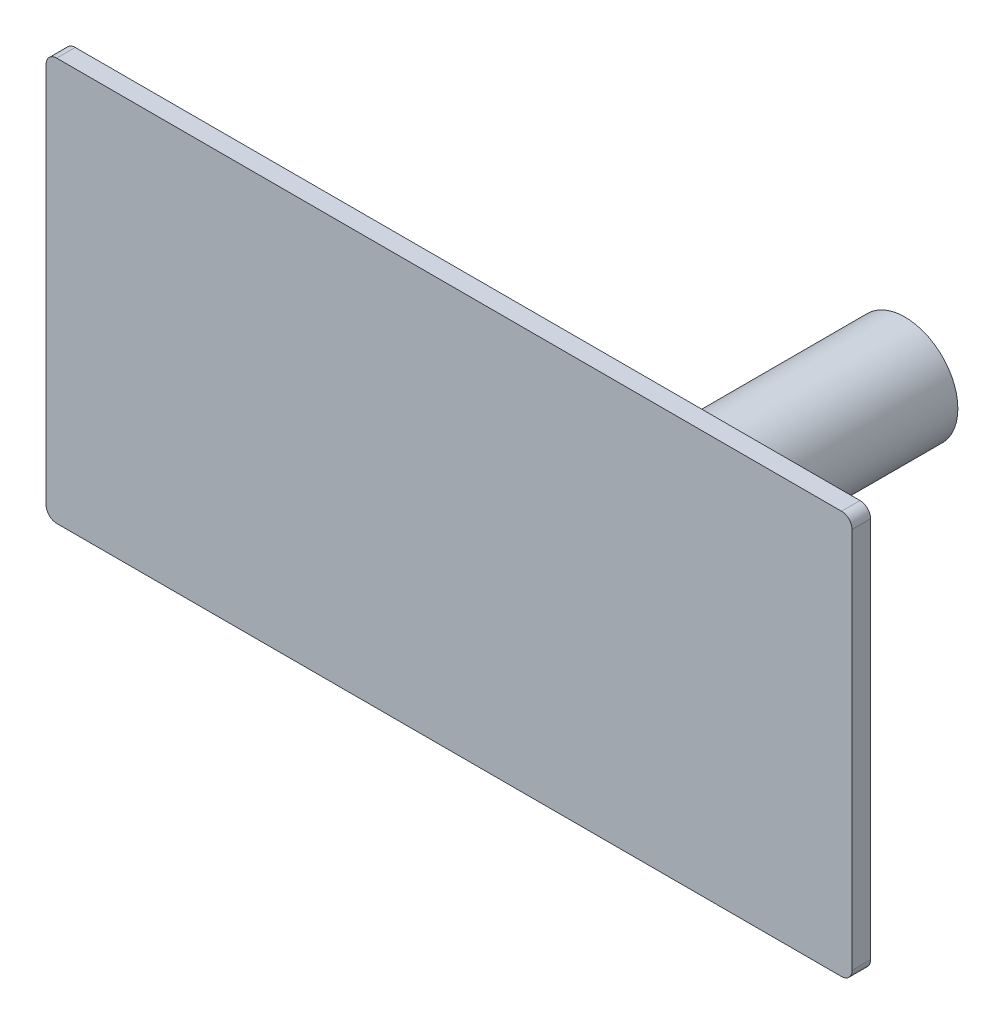
ISO-10303-21;
HEADER;
FILE_DESCRIPTION(('STEP AP214'),'2;1');
FILE_NAME('part.step','',(''),(''),'','','');
FILE_SCHEMA(('AUTOMOTIVE_DESIGN { 1 0 10303 214 1 1 1 1 }'));
ENDSEC;
DATA;
#1=APPLICATION_CONTEXT('core data for automotive mechanical design processes');
#2=APPLICATION_PROTOCOL_DEFINITION('international standard','automotive_design',2000,#1);
#3=PRODUCT_CONTEXT('',#1,'mechanical');
#4=PRODUCT('Part','Part','',(#3));
#5=PRODUCT_RELATED_PRODUCT_CATEGORY('part','',(#4));
#6=PRODUCT_DEFINITION_FORMATION('','',#4);
#7=PRODUCT_DEFINITION_CONTEXT('part definition',#1,'design');
#8=PRODUCT_DEFINITION('design','',#6,#7);
#9=PRODUCT_DEFINITION_SHAPE('','',#8);
#10=(LENGTH_UNIT() NAMED_UNIT(*) SI_UNIT(.MILLI.,.METRE.));
#11=(NAMED_UNIT(*) PLANE_ANGLE_UNIT() SI_UNIT($,.RADIAN.));
#12=(NAMED_UNIT(*) SI_UNIT($,.STERADIAN.) SOLID_ANGLE_UNIT());
#13=UNCERTAINTY_MEASURE_WITH_UNIT(LENGTH_MEASURE(1.E-05),#10,'distance_accuracy_value','');
#14=(GEOMETRIC_REPRESENTATION_CONTEXT(3) GLOBAL_UNCERTAINTY_ASSIGNED_CONTEXT((#13)) GLOBAL_UNIT_ASSIGNED_CONTEXT((#10,
#11,#12)) REPRESENTATION_CONTEXT('',''));
#15=CARTESIAN_POINT('',(0.,0.,0.));
#16=DIRECTION('',(0.,0.,1.));
#17=DIRECTION('',(1.,0.,0.));
#18=AXIS2_PLACEMENT_3D('',#15,#16,#17);
#19=CARTESIAN_POINT('',(38.1,-19.05,1.75));
#20=DIRECTION('',(-1.,0.,0.));
#21=DIRECTION('',(0.,0.,1.));
#22=AXIS2_PLACEMENT_3D('',#19,#20,#21);
#23=PLANE('',#22);
#24=DIRECTION('',(0.,1.,0.));
#25=VECTOR('',#24,1.);
#26=CARTESIAN_POINT('',(38.1,-19.05,1.75));
#27=LINE('',#26,#25);
#28=CARTESIAN_POINT('',(38.1,-18.05,1.75));
#29=VERTEX_POINT('',#28);
#30=CARTESIAN_POINT('',(38.1,18.05,1.75));
#31=VERTEX_POINT('',#30);
#32=EDGE_CURVE('E141',#29,#31,#27,.T.);
#33=ORIENTED_EDGE('',*,*,#32,.F.);
#34=DIRECTION('',(0.,0.,-1.));
#35=VECTOR('',#34,1.);
#36=CARTESIAN_POINT('',(38.1,-18.05,1.75));
#37=LINE('',#36,#35);
#38=CARTESIAN_POINT('',(38.1,-18.05,0.));
#39=VERTEX_POINT('',#38);
#40=EDGE_CURVE('E125',#29,#39,#37,.T.);
#41=ORIENTED_EDGE('',*,*,#40,.T.);
#42=DIRECTION('',(0.,1.,0.));
#43=VECTOR('',#42,1.);
#44=CARTESIAN_POINT('',(38.1,-19.05,0.));
#45=LINE('',#44,#43);
#46=CARTESIAN_POINT('',(38.1,18.05,0.));
#47=VERTEX_POINT('',#46);
#48=EDGE_CURVE('E138',#39,#47,#45,.T.);
#49=ORIENTED_EDGE('',*,*,#48,.T.);
#50=DIRECTION('',(0.,0.,-1.));
#51=VECTOR('',#50,1.);
#52=CARTESIAN_POINT('',(38.1,18.05,1.75));
#53=LINE('',#52,#51);
#54=EDGE_CURVE('E144',#47,#31,#53,.F.);
#55=ORIENTED_EDGE('',*,*,#54,.T.);
#56=EDGE_LOOP('',(#33,#41,#49,#55));
#57=FACE_BOUND('',#56,.T.);
#58=ADVANCED_FACE('F41',(#57),#23,.F.);
#59=CARTESIAN_POINT('',(-38.1,19.05,1.75));
#60=DIRECTION('',(0.,-1.,0.));
#61=DIRECTION('',(0.,0.,-1.));
#62=AXIS2_PLACEMENT_3D('',#59,#60,#61);
#63=PLANE('',#62);
#64=DIRECTION('',(-1.,0.,0.));
#65=VECTOR('',#64,1.);
#66=CARTESIAN_POINT('',(-38.1,19.05,0.));
#67=LINE('',#66,#65);
#68=CARTESIAN_POINT('',(37.1,19.05,0.));
#69=VERTEX_POINT('',#68);
#70=CARTESIAN_POINT('',(-37.1,19.05,0.));
#71=VERTEX_POINT('',#70);
#72=EDGE_CURVE('E150',#69,#71,#67,.T.);
#73=ORIENTED_EDGE('',*,*,#72,.T.);
#74=DIRECTION('',(0.,0.,-1.));
#75=VECTOR('',#74,1.);
#76=CARTESIAN_POINT('',(-37.1,19.05,1.75));
#77=LINE('',#76,#75);
#78=CARTESIAN_POINT('',(-37.1,19.05,1.75));
#79=VERTEX_POINT('',#78);
#80=EDGE_CURVE('E50',#71,#79,#77,.F.);
#81=ORIENTED_EDGE('',*,*,#80,.T.);
#82=DIRECTION('',(-1.,0.,0.));
#83=VECTOR('',#82,1.);
#84=CARTESIAN_POINT('',(-38.1,19.05,1.75));
#85=LINE('',#84,#83);
#86=CARTESIAN_POINT('',(37.1,19.05,1.75));
#87=VERTEX_POINT('',#86);
#88=EDGE_CURVE('E203',#87,#79,#85,.T.);
#89=ORIENTED_EDGE('',*,*,#88,.F.);
#90=DIRECTION('',(0.,0.,-1.));
#91=VECTOR('',#90,1.);
#92=CARTESIAN_POINT('',(37.1,19.05,1.75));
#93=LINE('',#92,#91);
#94=EDGE_CURVE('E196',#87,#69,#93,.T.);
#95=ORIENTED_EDGE('',*,*,#94,.T.);
#96=EDGE_LOOP('',(#73,#81,#89,#95));
#97=FACE_BOUND('',#96,.T.);
#98=ADVANCED_FACE('F202',(#97),#63,.F.);
#99=CARTESIAN_POINT('',(-38.1,-19.05,1.75));
#100=DIRECTION('',(1.,0.,0.));
#101=DIRECTION('',(0.,0.,-1.));
#102=AXIS2_PLACEMENT_3D('',#99,#100,#101);
#103=PLANE('',#102);
#104=DIRECTION('',(0.,-1.,0.));
#105=VECTOR('',#104,1.);
#106=CARTESIAN_POINT('',(-38.1,-19.05,1.75));
#107=LINE('',#106,#105);
#108=CARTESIAN_POINT('',(-38.1,18.05,1.75));
#109=VERTEX_POINT('',#108);
#110=CARTESIAN_POINT('',(-38.1,-18.05,1.75));
#111=VERTEX_POINT('',#110);
#112=EDGE_CURVE('E210',#109,#111,#107,.T.);
#113=ORIENTED_EDGE('',*,*,#112,.F.);
#114=DIRECTION('',(0.,0.,-1.));
#115=VECTOR('',#114,1.);
#116=CARTESIAN_POINT('',(-38.1,18.05,1.75));
#117=LINE('',#116,#115);
#118=CARTESIAN_POINT('',(-38.1,18.05,0.));
#119=VERTEX_POINT('',#118);
#120=EDGE_CURVE('E193',#109,#119,#117,.T.);
#121=ORIENTED_EDGE('',*,*,#120,.T.);
#122=DIRECTION('',(0.,-1.,0.));
#123=VECTOR('',#122,1.);
#124=CARTESIAN_POINT('',(-38.1,-19.05,0.));
#125=LINE('',#124,#123);
#126=CARTESIAN_POINT('',(-38.1,-18.05,0.));
#127=VERTEX_POINT('',#126);
#128=EDGE_CURVE('E156',#119,#127,#125,.T.);
#129=ORIENTED_EDGE('',*,*,#128,.T.);
#130=DIRECTION('',(0.,0.,-1.));
#131=VECTOR('',#130,1.);
#132=CARTESIAN_POINT('',(-38.1,-18.05,1.75));
#133=LINE('',#132,#131);
#134=EDGE_CURVE('E60',#127,#111,#133,.F.);
#135=ORIENTED_EDGE('',*,*,#134,.T.);
#136=EDGE_LOOP('',(#113,#121,#129,#135));
#137=FACE_BOUND('',#136,.T.);
#138=ADVANCED_FACE('F215',(#137),#103,.F.);
#139=CARTESIAN_POINT('',(-38.1,-19.05,1.75));
#140=DIRECTION('',(0.,1.,0.));
#141=DIRECTION('',(0.,0.,1.));
#142=AXIS2_PLACEMENT_3D('',#139,#140,#141);
#143=PLANE('',#142);
#144=DIRECTION('',(1.,0.,0.));
#145=VECTOR('',#144,1.);
#146=CARTESIAN_POINT('',(-38.1,-19.05,0.));
#147=LINE('',#146,#145);
#148=CARTESIAN_POINT('',(-37.1,-19.05,0.));
#149=VERTEX_POINT('',#148);
#150=CARTESIAN_POINT('',(37.1,-19.05,0.));
#151=VERTEX_POINT('',#150);
#152=EDGE_CURVE('E167',#149,#151,#147,.T.);
#153=ORIENTED_EDGE('',*,*,#152,.T.);
#154=DIRECTION('',(0.,0.,-1.));
#155=VECTOR('',#154,1.);
#156=CARTESIAN_POINT('',(37.1,-19.05,1.75));
#157=LINE('',#156,#155);
#158=CARTESIAN_POINT('',(37.1,-19.05,1.75));
#159=VERTEX_POINT('',#158);
#160=EDGE_CURVE('E126',#151,#159,#157,.F.);
#161=ORIENTED_EDGE('',*,*,#160,.T.);
#162=DIRECTION('',(1.,0.,0.));
#163=VECTOR('',#162,1.);
#164=CARTESIAN_POINT('',(-38.1,-19.05,1.75));
#165=LINE('',#164,#163);
#166=CARTESIAN_POINT('',(-37.1,-19.05,1.75));
#167=VERTEX_POINT('',#166);
#168=EDGE_CURVE('E162',#167,#159,#165,.T.);
#169=ORIENTED_EDGE('',*,*,#168,.F.);
#170=DIRECTION('',(0.,0.,-1.));
#171=VECTOR('',#170,1.);
#172=CARTESIAN_POINT('',(-37.1,-19.05,1.75));
#173=LINE('',#172,#171);
#174=EDGE_CURVE('E132',#167,#149,#173,.T.);
#175=ORIENTED_EDGE('',*,*,#174,.T.);
#176=EDGE_LOOP('',(#153,#161,#169,#175));
#177=FACE_BOUND('',#176,.T.);
#178=ADVANCED_FACE('F221',(#177),#143,.F.);
#179=CARTESIAN_POINT('',(0.,0.,1.75));
#180=DIRECTION('',(0.,0.,-1.));
#181=DIRECTION('',(-1.,0.,0.));
#182=AXIS2_PLACEMENT_3D('',#179,#180,#181);
#183=PLANE('',#182);
#184=ORIENTED_EDGE('',*,*,#168,.T.);
#185=CARTESIAN_POINT('',(37.1,-18.05,1.75));
#186=DIRECTION('',(0.,0.,-1.));
#187=DIRECTION('',(-1.,0.,0.));
#188=AXIS2_PLACEMENT_3D('',#185,#186,#187);
#189=CIRCLE('',#188,1.);
#190=EDGE_CURVE('E189',#159,#29,#189,.F.);
#191=ORIENTED_EDGE('',*,*,#190,.T.);
#192=ORIENTED_EDGE('',*,*,#32,.T.);
#193=CARTESIAN_POINT('',(37.1,18.05,1.75));
#194=DIRECTION('',(0.,0.,-1.));
#195=DIRECTION('',(-1.,0.,0.));
#196=AXIS2_PLACEMENT_3D('',#193,#194,#195);
#197=CIRCLE('',#196,1.);
#198=EDGE_CURVE('E185',#31,#87,#197,.F.);
#199=ORIENTED_EDGE('',*,*,#198,.T.);
#200=ORIENTED_EDGE('',*,*,#88,.T.);
#201=CARTESIAN_POINT('',(-37.1,18.05,1.75));
#202=DIRECTION('',(0.,0.,-1.));
#203=DIRECTION('',(-1.,0.,0.));
#204=AXIS2_PLACEMENT_3D('',#201,#202,#203);
#205=CIRCLE('',#204,1.);
#206=EDGE_CURVE('E67',#79,#109,#205,.F.);
#207=ORIENTED_EDGE('',*,*,#206,.T.);
#208=ORIENTED_EDGE('',*,*,#112,.T.);
#209=CARTESIAN_POINT('',(-37.1,-18.05,1.75));
#210=DIRECTION('',(0.,0.,-1.));
#211=DIRECTION('',(-1.,0.,0.));
#212=AXIS2_PLACEMENT_3D('',#209,#210,#211);
#213=CIRCLE('',#212,1.);
#214=EDGE_CURVE('E182',#111,#167,#213,.F.);
#215=ORIENTED_EDGE('',*,*,#214,.T.);
#216=EDGE_LOOP('',(#184,#191,#192,#199,#200,#207,#208,#215));
#217=FACE_BOUND('',#216,.T.);
#218=ADVANCED_FACE('F207',(#217),#183,.F.);
#219=CARTESIAN_POINT('',(0.,0.,0.));
#220=DIRECTION('',(0.,0.,-1.));
#221=DIRECTION('',(-1.,0.,0.));
#222=AXIS2_PLACEMENT_3D('',#219,#220,#221);
#223=PLANE('',#222);
#224=CARTESIAN_POINT('',(13.1,2.95,0.));
#225=DIRECTION('',(0.,0.,-1.));
#226=DIRECTION('',(-1.,0.,0.));
#227=AXIS2_PLACEMENT_3D('',#224,#225,#226);
#228=CIRCLE('',#227,5.);
#229=CARTESIAN_POINT('',(8.10000000000001,2.95,0.));
#230=VERTEX_POINT('',#229);
#231=EDGE_CURVE('E11',#230,#230,#228,.T.);
#232=ORIENTED_EDGE('',*,*,#231,.F.);
#233=EDGE_LOOP('',(#232));
#234=FACE_BOUND('',#233,.T.);
#235=ORIENTED_EDGE('',*,*,#48,.F.);
#236=CARTESIAN_POINT('',(37.1,-18.05,0.));
#237=DIRECTION('',(0.,0.,-1.));
#238=DIRECTION('',(-1.,0.,0.));
#239=AXIS2_PLACEMENT_3D('',#236,#237,#238);
#240=CIRCLE('',#239,1.);
#241=EDGE_CURVE('E121',#39,#151,#240,.T.);
#242=ORIENTED_EDGE('',*,*,#241,.T.);
#243=ORIENTED_EDGE('',*,*,#152,.F.);
#244=CARTESIAN_POINT('',(-37.1,-18.05,0.));
#245=DIRECTION('',(0.,0.,-1.));
#246=DIRECTION('',(-1.,0.,0.));
#247=AXIS2_PLACEMENT_3D('',#244,#245,#246);
#248=CIRCLE('',#247,1.);
#249=EDGE_CURVE('E143',#149,#127,#248,.T.);
#250=ORIENTED_EDGE('',*,*,#249,.T.);
#251=ORIENTED_EDGE('',*,*,#128,.F.);
#252=CARTESIAN_POINT('',(-37.1,18.05,0.));
#253=DIRECTION('',(0.,0.,-1.));
#254=DIRECTION('',(-1.,0.,0.));
#255=AXIS2_PLACEMENT_3D('',#252,#253,#254);
#256=CIRCLE('',#255,1.);
#257=EDGE_CURVE('E133',#119,#71,#256,.T.);
#258=ORIENTED_EDGE('',*,*,#257,.T.);
#259=ORIENTED_EDGE('',*,*,#72,.F.);
#260=CARTESIAN_POINT('',(37.1,18.05,0.));
#261=DIRECTION('',(0.,0.,-1.));
#262=DIRECTION('',(-1.,0.,0.));
#263=AXIS2_PLACEMENT_3D('',#260,#261,#262);
#264=CIRCLE('',#263,1.);
#265=EDGE_CURVE('E148',#69,#47,#264,.T.);
#266=ORIENTED_EDGE('',*,*,#265,.T.);
#267=EDGE_LOOP('',(#235,#242,#243,#250,#251,#258,#259,#266));
#268=FACE_BOUND('',#267,.T.);
#269=ADVANCED_FACE('F146',(#234,#268),#223,.T.);
#270=CARTESIAN_POINT('',(37.1,-18.05,1.75));
#271=DIRECTION('',(0.,0.,-1.));
#272=DIRECTION('',(-1.,0.,0.));
#273=AXIS2_PLACEMENT_3D('',#270,#271,#272);
#274=CYLINDRICAL_SURFACE('',#273,1.);
#275=ORIENTED_EDGE('',*,*,#190,.F.);
#276=ORIENTED_EDGE('',*,*,#160,.F.);
#277=ORIENTED_EDGE('',*,*,#241,.F.);
#278=ORIENTED_EDGE('',*,*,#40,.F.);
#279=EDGE_LOOP('',(#275,#276,#277,#278));
#280=FACE_BOUND('',#279,.T.);
#281=ADVANCED_FACE('F124',(#280),#274,.T.);
#282=CARTESIAN_POINT('',(-37.1,18.05,1.75));
#283=DIRECTION('',(0.,0.,-1.));
#284=DIRECTION('',(-1.,0.,0.));
#285=AXIS2_PLACEMENT_3D('',#282,#283,#284);
#286=CYLINDRICAL_SURFACE('',#285,1.);
#287=ORIENTED_EDGE('',*,*,#206,.F.);
#288=ORIENTED_EDGE('',*,*,#80,.F.);
#289=ORIENTED_EDGE('',*,*,#257,.F.);
#290=ORIENTED_EDGE('',*,*,#120,.F.);
#291=EDGE_LOOP('',(#287,#288,#289,#290));
#292=FACE_BOUND('',#291,.T.);
#293=ADVANCED_FACE('F213',(#292),#286,.T.);
#294=CARTESIAN_POINT('',(37.1,18.05,1.75));
#295=DIRECTION('',(0.,0.,-1.));
#296=DIRECTION('',(-1.,0.,0.));
#297=AXIS2_PLACEMENT_3D('',#294,#295,#296);
#298=CYLINDRICAL_SURFACE('',#297,1.);
#299=ORIENTED_EDGE('',*,*,#198,.F.);
#300=ORIENTED_EDGE('',*,*,#54,.F.);
#301=ORIENTED_EDGE('',*,*,#265,.F.);
#302=ORIENTED_EDGE('',*,*,#94,.F.);
#303=EDGE_LOOP('',(#299,#300,#301,#302));
#304=FACE_BOUND('',#303,.T.);
#305=ADVANCED_FACE('F227',(#304),#298,.T.);
#306=CARTESIAN_POINT('',(-37.1,-18.05,1.75));
#307=DIRECTION('',(0.,0.,-1.));
#308=DIRECTION('',(-1.,0.,0.));
#309=AXIS2_PLACEMENT_3D('',#306,#307,#308);
#310=CYLINDRICAL_SURFACE('',#309,1.);
#311=ORIENTED_EDGE('',*,*,#214,.F.);
#312=ORIENTED_EDGE('',*,*,#134,.F.);
#313=ORIENTED_EDGE('',*,*,#249,.F.);
#314=ORIENTED_EDGE('',*,*,#174,.F.);
#315=EDGE_LOOP('',(#311,#312,#313,#314));
#316=FACE_BOUND('',#315,.T.);
#317=ADVANCED_FACE('F43',(#316),#310,.T.);
#318=CARTESIAN_POINT('',(13.1,2.95,-28.25));
#319=DIRECTION('',(0.,0.,1.));
#320=DIRECTION('',(1.,0.,0.));
#321=AXIS2_PLACEMENT_3D('',#318,#319,#320);
#322=CYLINDRICAL_SURFACE('',#321,5.);
#323=ORIENTED_EDGE('',*,*,#231,.T.);
#324=EDGE_LOOP('',(#323));
#325=FACE_BOUND('',#324,.T.);
#326=CARTESIAN_POINT('',(13.1,2.95,-28.25));
#327=DIRECTION('',(0.,0.,1.));
#328=DIRECTION('',(1.,0.,0.));
#329=AXIS2_PLACEMENT_3D('',#326,#327,#328);
#330=CIRCLE('',#329,5.);
#331=CARTESIAN_POINT('',(18.1,2.95,-28.25));
#332=VERTEX_POINT('',#331);
#333=EDGE_CURVE('E151',#332,#332,#330,.T.);
#334=ORIENTED_EDGE('',*,*,#333,.T.);
#335=EDGE_LOOP('',(#334));
#336=FACE_BOUND('',#335,.T.);
#337=ADVANCED_FACE('F233',(#325,#336),#322,.T.);
#338=CARTESIAN_POINT('',(13.1,2.95,-28.25));
#339=DIRECTION('',(0.,0.,1.));
#340=DIRECTION('',(1.,0.,0.));
#341=AXIS2_PLACEMENT_3D('',#338,#339,#340);
#342=PLANE('',#341);
#343=ORIENTED_EDGE('',*,*,#333,.F.);
#344=EDGE_LOOP('',(#343));
#345=FACE_BOUND('',#344,.T.);
#346=ADVANCED_FACE('F288',(#345),#342,.F.);
#347=CLOSED_SHELL('',(#58,#98,#138,#178,#218,#269,#281,#293,#305,#317,#337,#346));
#348=MANIFOLD_SOLID_BREP('B2',#347);
#349=ADVANCED_BREP_SHAPE_REPRESENTATION('',(#18,#348),#14);
#350=SHAPE_DEFINITION_REPRESENTATION(#9,#349);
ENDSEC;
END-ISO-10303-21;
